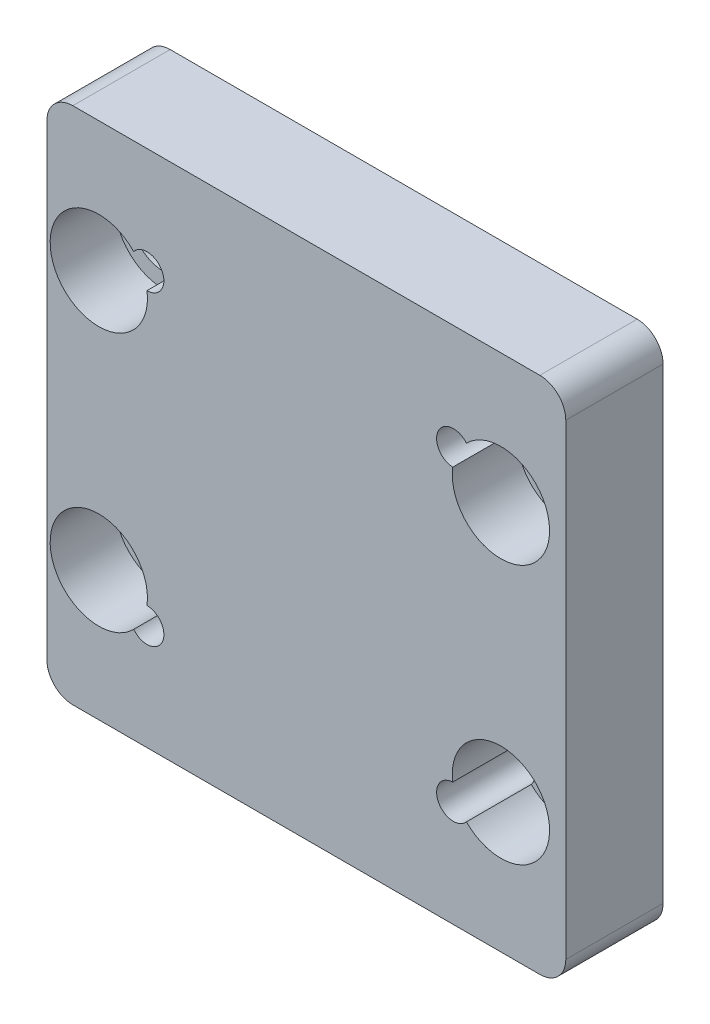
ISO-10303-21;
HEADER;
FILE_DESCRIPTION(('STEP AP214'),'2;1');
FILE_NAME('part.step','',(''),(''),'','','');
FILE_SCHEMA(('AUTOMOTIVE_DESIGN { 1 0 10303 214 1 1 1 1 }'));
ENDSEC;
DATA;
#1=APPLICATION_CONTEXT('core data for automotive mechanical design processes');
#2=APPLICATION_PROTOCOL_DEFINITION('international standard','automotive_design',2000,#1);
#3=PRODUCT_CONTEXT('',#1,'mechanical');
#4=PRODUCT('Part','Part','',(#3));
#5=PRODUCT_RELATED_PRODUCT_CATEGORY('part','',(#4));
#6=PRODUCT_DEFINITION_FORMATION('','',#4);
#7=PRODUCT_DEFINITION_CONTEXT('part definition',#1,'design');
#8=PRODUCT_DEFINITION('design','',#6,#7);
#9=PRODUCT_DEFINITION_SHAPE('','',#8);
#10=(LENGTH_UNIT() NAMED_UNIT(*) SI_UNIT(.MILLI.,.METRE.));
#11=(NAMED_UNIT(*) PLANE_ANGLE_UNIT() SI_UNIT($,.RADIAN.));
#12=(NAMED_UNIT(*) SI_UNIT($,.STERADIAN.) SOLID_ANGLE_UNIT());
#13=UNCERTAINTY_MEASURE_WITH_UNIT(LENGTH_MEASURE(1.E-05),#10,'distance_accuracy_value','');
#14=(GEOMETRIC_REPRESENTATION_CONTEXT(3) GLOBAL_UNCERTAINTY_ASSIGNED_CONTEXT((#13)) GLOBAL_UNIT_ASSIGNED_CONTEXT((#10,
#11,#12)) REPRESENTATION_CONTEXT('',''));
#15=CARTESIAN_POINT('',(0.,0.,0.));
#16=DIRECTION('',(0.,0.,1.));
#17=DIRECTION('',(1.,0.,0.));
#18=AXIS2_PLACEMENT_3D('',#15,#16,#17);
#19=CARTESIAN_POINT('',(0.,0.,9.525));
#20=DIRECTION('',(0.,0.,-1.));
#21=DIRECTION('',(-1.,0.,0.));
#22=AXIS2_PLACEMENT_3D('',#19,#20,#21);
#23=PLANE('',#22);
#24=DIRECTION('',(1.,0.,0.));
#25=VECTOR('',#24,1.);
#26=CARTESIAN_POINT('',(0.,0.,9.525));
#27=LINE('',#26,#25);
#28=CARTESIAN_POINT('',(2.54,0.,9.525));
#29=VERTEX_POINT('',#28);
#30=CARTESIAN_POINT('',(48.26,0.,9.525));
#31=VERTEX_POINT('',#30);
#32=EDGE_CURVE('E217',#29,#31,#27,.T.);
#33=ORIENTED_EDGE('',*,*,#32,.T.);
#34=CARTESIAN_POINT('',(48.26,2.54,9.525));
#35=DIRECTION('',(0.,0.,-1.));
#36=DIRECTION('',(-1.,0.,0.));
#37=AXIS2_PLACEMENT_3D('',#34,#35,#36);
#38=CIRCLE('',#37,2.54);
#39=CARTESIAN_POINT('',(50.8,2.54,9.525));
#40=VERTEX_POINT('',#39);
#41=EDGE_CURVE('E195',#31,#40,#38,.F.);
#42=ORIENTED_EDGE('',*,*,#41,.T.);
#43=DIRECTION('',(0.,1.,0.));
#44=VECTOR('',#43,1.);
#45=CARTESIAN_POINT('',(50.8,0.,9.525));
#46=LINE('',#45,#44);
#47=CARTESIAN_POINT('',(50.8,48.26,9.525));
#48=VERTEX_POINT('',#47);
#49=EDGE_CURVE('E277',#40,#48,#46,.T.);
#50=ORIENTED_EDGE('',*,*,#49,.T.);
#51=CARTESIAN_POINT('',(48.26,48.26,9.525));
#52=DIRECTION('',(0.,0.,-1.));
#53=DIRECTION('',(-1.,0.,0.));
#54=AXIS2_PLACEMENT_3D('',#51,#52,#53);
#55=CIRCLE('',#54,2.54);
#56=CARTESIAN_POINT('',(48.26,50.8,9.525));
#57=VERTEX_POINT('',#56);
#58=EDGE_CURVE('E55',#48,#57,#55,.F.);
#59=ORIENTED_EDGE('',*,*,#58,.T.);
#60=DIRECTION('',(-1.,0.,0.));
#61=VECTOR('',#60,1.);
#62=CARTESIAN_POINT('',(0.,50.8,9.525));
#63=LINE('',#62,#61);
#64=CARTESIAN_POINT('',(2.54,50.8,9.525));
#65=VERTEX_POINT('',#64);
#66=EDGE_CURVE('E206',#57,#65,#63,.T.);
#67=ORIENTED_EDGE('',*,*,#66,.T.);
#68=CARTESIAN_POINT('',(2.54,48.26,9.525));
#69=DIRECTION('',(0.,0.,-1.));
#70=DIRECTION('',(-1.,0.,0.));
#71=AXIS2_PLACEMENT_3D('',#68,#69,#70);
#72=CIRCLE('',#71,2.54);
#73=CARTESIAN_POINT('',(0.,48.26,9.525));
#74=VERTEX_POINT('',#73);
#75=EDGE_CURVE('E191',#65,#74,#72,.F.);
#76=ORIENTED_EDGE('',*,*,#75,.T.);
#77=DIRECTION('',(0.,-1.,0.));
#78=VECTOR('',#77,1.);
#79=CARTESIAN_POINT('',(0.,0.,9.525));
#80=LINE('',#79,#78);
#81=CARTESIAN_POINT('',(0.,2.54,9.525));
#82=VERTEX_POINT('',#81);
#83=EDGE_CURVE('E213',#74,#82,#80,.T.);
#84=ORIENTED_EDGE('',*,*,#83,.T.);
#85=CARTESIAN_POINT('',(2.54,2.54,9.525));
#86=DIRECTION('',(0.,0.,-1.));
#87=DIRECTION('',(-1.,0.,0.));
#88=AXIS2_PLACEMENT_3D('',#85,#86,#87);
#89=CIRCLE('',#88,2.54);
#90=EDGE_CURVE('E193',#82,#29,#89,.F.);
#91=ORIENTED_EDGE('',*,*,#90,.T.);
#92=EDGE_LOOP('',(#33,#42,#50,#59,#67,#76,#84,#91));
#93=FACE_BOUND('',#92,.T.);
#94=CARTESIAN_POINT('',(39.8,10.4,9.525));
#95=DIRECTION('',(0.,0.,1.));
#96=DIRECTION('',(1.,0.,0.));
#97=AXIS2_PLACEMENT_3D('',#94,#95,#96);
#98=CIRCLE('',#97,1.65);
#99=CARTESIAN_POINT('',(39.7322573472271,12.0486087871279,9.525));
#100=VERTEX_POINT('',#99);
#101=CARTESIAN_POINT('',(41.0691996314074,9.34566025606765,9.525));
#102=VERTEX_POINT('',#101);
#103=EDGE_CURVE('E262',#100,#102,#98,.T.);
#104=ORIENTED_EDGE('',*,*,#103,.F.);
#105=CARTESIAN_POINT('',(44.45,12.7,9.525));
#106=DIRECTION('',(0.,0.,1.));
#107=DIRECTION('',(1.,0.,0.));
#108=AXIS2_PLACEMENT_3D('',#105,#106,#107);
#109=CIRCLE('',#108,4.7625);
#110=EDGE_CURVE('E601',#102,#100,#109,.T.);
#111=ORIENTED_EDGE('',*,*,#110,.F.);
#112=EDGE_LOOP('',(#104,#111));
#113=FACE_BOUND('',#112,.T.);
#114=CARTESIAN_POINT('',(9.8,40.4,9.525));
#115=DIRECTION('',(0.,0.,1.));
#116=DIRECTION('',(1.,0.,0.));
#117=AXIS2_PLACEMENT_3D('',#114,#115,#116);
#118=CIRCLE('',#117,1.65);
#119=CARTESIAN_POINT('',(9.79793435404736,38.7500012929984,9.525));
#120=VERTEX_POINT('',#119);
#121=CARTESIAN_POINT('',(8.49924029156137,41.4151473690567,9.525));
#122=VERTEX_POINT('',#121);
#123=EDGE_CURVE('E265',#120,#122,#118,.T.);
#124=ORIENTED_EDGE('',*,*,#123,.F.);
#125=CARTESIAN_POINT('',(5.07999999999999,38.1,9.525));
#126=DIRECTION('',(0.,0.,1.));
#127=DIRECTION('',(1.,0.,0.));
#128=AXIS2_PLACEMENT_3D('',#125,#126,#127);
#129=CIRCLE('',#128,4.7625);
#130=EDGE_CURVE('E622',#122,#120,#129,.T.);
#131=ORIENTED_EDGE('',*,*,#130,.F.);
#132=EDGE_LOOP('',(#124,#131));
#133=FACE_BOUND('',#132,.T.);
#134=CARTESIAN_POINT('',(39.8,40.4,9.525));
#135=DIRECTION('',(0.,0.,1.));
#136=DIRECTION('',(1.,0.,0.));
#137=AXIS2_PLACEMENT_3D('',#134,#135,#136);
#138=CIRCLE('',#137,1.65);
#139=CARTESIAN_POINT('',(41.0691996314074,41.4543397439323,9.525));
#140=VERTEX_POINT('',#139);
#141=CARTESIAN_POINT('',(39.7322573472271,38.7513912128721,9.525));
#142=VERTEX_POINT('',#141);
#143=EDGE_CURVE('E612',#140,#142,#138,.T.);
#144=ORIENTED_EDGE('',*,*,#143,.F.);
#145=CARTESIAN_POINT('',(44.45,38.1,9.525));
#146=DIRECTION('',(0.,0.,1.));
#147=DIRECTION('',(1.,0.,0.));
#148=AXIS2_PLACEMENT_3D('',#145,#146,#147);
#149=CIRCLE('',#148,4.7625);
#150=EDGE_CURVE('E153',#142,#140,#149,.T.);
#151=ORIENTED_EDGE('',*,*,#150,.F.);
#152=EDGE_LOOP('',(#144,#151));
#153=FACE_BOUND('',#152,.T.);
#154=CARTESIAN_POINT('',(5.07999999999999,12.7,9.525));
#155=DIRECTION('',(0.,0.,1.));
#156=DIRECTION('',(1.,0.,0.));
#157=AXIS2_PLACEMENT_3D('',#154,#155,#156);
#158=CIRCLE('',#157,4.7625);
#159=CARTESIAN_POINT('',(9.79793435404736,12.0499987070016,9.525));
#160=VERTEX_POINT('',#159);
#161=CARTESIAN_POINT('',(8.49924029156137,9.38485263094334,9.525));
#162=VERTEX_POINT('',#161);
#163=EDGE_CURVE('E257',#160,#162,#158,.T.);
#164=ORIENTED_EDGE('',*,*,#163,.F.);
#165=CARTESIAN_POINT('',(9.79999999999999,10.4,9.525));
#166=DIRECTION('',(0.,0.,1.));
#167=DIRECTION('',(1.,0.,0.));
#168=AXIS2_PLACEMENT_3D('',#165,#166,#167);
#169=CIRCLE('',#168,1.65);
#170=EDGE_CURVE('E251',#162,#160,#169,.T.);
#171=ORIENTED_EDGE('',*,*,#170,.F.);
#172=EDGE_LOOP('',(#164,#171));
#173=FACE_BOUND('',#172,.T.);
#174=ADVANCED_FACE('F35',(#93,#113,#133,#153,#173),#23,.F.);
#175=CARTESIAN_POINT('',(0.,0.,9.525));
#176=DIRECTION('',(1.,0.,0.));
#177=DIRECTION('',(0.,0.,-1.));
#178=AXIS2_PLACEMENT_3D('',#175,#176,#177);
#179=PLANE('',#178);
#180=DIRECTION('',(0.,-1.,0.));
#181=VECTOR('',#180,1.);
#182=CARTESIAN_POINT('',(0.,0.,0.));
#183=LINE('',#182,#181);
#184=CARTESIAN_POINT('',(0.,48.26,0.));
#185=VERTEX_POINT('',#184);
#186=CARTESIAN_POINT('',(0.,2.54,0.));
#187=VERTEX_POINT('',#186);
#188=EDGE_CURVE('E273',#185,#187,#183,.T.);
#189=ORIENTED_EDGE('',*,*,#188,.T.);
#190=DIRECTION('',(0.,0.,-1.));
#191=VECTOR('',#190,1.);
#192=CARTESIAN_POINT('',(0.,2.54,9.525));
#193=LINE('',#192,#191);
#194=EDGE_CURVE('E200',#187,#82,#193,.F.);
#195=ORIENTED_EDGE('',*,*,#194,.T.);
#196=ORIENTED_EDGE('',*,*,#83,.F.);
#197=DIRECTION('',(0.,0.,-1.));
#198=VECTOR('',#197,1.);
#199=CARTESIAN_POINT('',(0.,48.26,9.525));
#200=LINE('',#199,#198);
#201=EDGE_CURVE('E197',#74,#185,#200,.T.);
#202=ORIENTED_EDGE('',*,*,#201,.T.);
#203=EDGE_LOOP('',(#189,#195,#196,#202));
#204=FACE_BOUND('',#203,.T.);
#205=ADVANCED_FACE('F305',(#204),#179,.F.);
#206=CARTESIAN_POINT('',(0.,0.,9.525));
#207=DIRECTION('',(0.,1.,0.));
#208=DIRECTION('',(0.,0.,1.));
#209=AXIS2_PLACEMENT_3D('',#206,#207,#208);
#210=PLANE('',#209);
#211=DIRECTION('',(1.,0.,0.));
#212=VECTOR('',#211,1.);
#213=CARTESIAN_POINT('',(0.,0.,0.));
#214=LINE('',#213,#212);
#215=CARTESIAN_POINT('',(2.54,0.,0.));
#216=VERTEX_POINT('',#215);
#217=CARTESIAN_POINT('',(48.26,0.,0.));
#218=VERTEX_POINT('',#217);
#219=EDGE_CURVE('E219',#216,#218,#214,.T.);
#220=ORIENTED_EDGE('',*,*,#219,.T.);
#221=DIRECTION('',(0.,0.,-1.));
#222=VECTOR('',#221,1.);
#223=CARTESIAN_POINT('',(48.26,0.,9.525));
#224=LINE('',#223,#222);
#225=EDGE_CURVE('E188',#218,#31,#224,.F.);
#226=ORIENTED_EDGE('',*,*,#225,.T.);
#227=ORIENTED_EDGE('',*,*,#32,.F.);
#228=DIRECTION('',(0.,0.,-1.));
#229=VECTOR('',#228,1.);
#230=CARTESIAN_POINT('',(2.54,0.,9.525));
#231=LINE('',#230,#229);
#232=EDGE_CURVE('E185',#29,#216,#231,.T.);
#233=ORIENTED_EDGE('',*,*,#232,.T.);
#234=EDGE_LOOP('',(#220,#226,#227,#233));
#235=FACE_BOUND('',#234,.T.);
#236=ADVANCED_FACE('F285',(#235),#210,.F.);
#237=CARTESIAN_POINT('',(50.8,0.,9.525));
#238=DIRECTION('',(-1.,0.,0.));
#239=DIRECTION('',(0.,0.,1.));
#240=AXIS2_PLACEMENT_3D('',#237,#238,#239);
#241=PLANE('',#240);
#242=ORIENTED_EDGE('',*,*,#49,.F.);
#243=DIRECTION('',(0.,0.,-1.));
#244=VECTOR('',#243,1.);
#245=CARTESIAN_POINT('',(50.8,2.54,9.525));
#246=LINE('',#245,#244);
#247=CARTESIAN_POINT('',(50.8,2.54,0.));
#248=VERTEX_POINT('',#247);
#249=EDGE_CURVE('E174',#40,#248,#246,.T.);
#250=ORIENTED_EDGE('',*,*,#249,.T.);
#251=DIRECTION('',(0.,1.,0.));
#252=VECTOR('',#251,1.);
#253=CARTESIAN_POINT('',(50.8,0.,0.));
#254=LINE('',#253,#252);
#255=CARTESIAN_POINT('',(50.8,48.26,0.));
#256=VERTEX_POINT('',#255);
#257=EDGE_CURVE('E214',#248,#256,#254,.T.);
#258=ORIENTED_EDGE('',*,*,#257,.T.);
#259=DIRECTION('',(0.,0.,-1.));
#260=VECTOR('',#259,1.);
#261=CARTESIAN_POINT('',(50.8,48.26,9.525));
#262=LINE('',#261,#260);
#263=EDGE_CURVE('E158',#256,#48,#262,.F.);
#264=ORIENTED_EDGE('',*,*,#263,.T.);
#265=EDGE_LOOP('',(#242,#250,#258,#264));
#266=FACE_BOUND('',#265,.T.);
#267=ADVANCED_FACE('F295',(#266),#241,.F.);
#268=CARTESIAN_POINT('',(0.,50.8,9.525));
#269=DIRECTION('',(0.,-1.,0.));
#270=DIRECTION('',(0.,0.,-1.));
#271=AXIS2_PLACEMENT_3D('',#268,#269,#270);
#272=PLANE('',#271);
#273=DIRECTION('',(-1.,0.,0.));
#274=VECTOR('',#273,1.);
#275=CARTESIAN_POINT('',(0.,50.8,0.));
#276=LINE('',#275,#274);
#277=CARTESIAN_POINT('',(48.26,50.8,0.));
#278=VERTEX_POINT('',#277);
#279=CARTESIAN_POINT('',(2.54,50.8,0.));
#280=VERTEX_POINT('',#279);
#281=EDGE_CURVE('E205',#278,#280,#276,.T.);
#282=ORIENTED_EDGE('',*,*,#281,.T.);
#283=DIRECTION('',(0.,0.,-1.));
#284=VECTOR('',#283,1.);
#285=CARTESIAN_POINT('',(2.54,50.8,9.525));
#286=LINE('',#285,#284);
#287=EDGE_CURVE('E11',#280,#65,#286,.F.);
#288=ORIENTED_EDGE('',*,*,#287,.T.);
#289=ORIENTED_EDGE('',*,*,#66,.F.);
#290=DIRECTION('',(0.,0.,-1.));
#291=VECTOR('',#290,1.);
#292=CARTESIAN_POINT('',(48.26,50.8,9.525));
#293=LINE('',#292,#291);
#294=EDGE_CURVE('E43',#57,#278,#293,.T.);
#295=ORIENTED_EDGE('',*,*,#294,.T.);
#296=EDGE_LOOP('',(#282,#288,#289,#295));
#297=FACE_BOUND('',#296,.T.);
#298=ADVANCED_FACE('F204',(#297),#272,.F.);
#299=CARTESIAN_POINT('',(0.,0.,0.));
#300=DIRECTION('',(0.,0.,-1.));
#301=DIRECTION('',(-1.,0.,0.));
#302=AXIS2_PLACEMENT_3D('',#299,#300,#301);
#303=PLANE('',#302);
#304=CARTESIAN_POINT('',(44.45,38.1,0.));
#305=DIRECTION('',(0.,0.,1.));
#306=DIRECTION('',(1.,0.,0.));
#307=AXIS2_PLACEMENT_3D('',#304,#305,#306);
#308=CIRCLE('',#307,3.2639);
#309=CARTESIAN_POINT('',(47.7139,38.1,0.));
#310=VERTEX_POINT('',#309);
#311=EDGE_CURVE('E658',#310,#310,#308,.T.);
#312=ORIENTED_EDGE('',*,*,#311,.T.);
#313=EDGE_LOOP('',(#312));
#314=FACE_BOUND('',#313,.T.);
#315=CARTESIAN_POINT('',(5.07999999999999,12.7,0.));
#316=DIRECTION('',(0.,0.,1.));
#317=DIRECTION('',(1.,0.,0.));
#318=AXIS2_PLACEMENT_3D('',#315,#316,#317);
#319=CIRCLE('',#318,3.2639);
#320=CARTESIAN_POINT('',(8.34389999999999,12.7,0.));
#321=VERTEX_POINT('',#320);
#322=EDGE_CURVE('E624',#321,#321,#319,.T.);
#323=ORIENTED_EDGE('',*,*,#322,.T.);
#324=EDGE_LOOP('',(#323));
#325=FACE_BOUND('',#324,.T.);
#326=CARTESIAN_POINT('',(5.07999999999999,38.1,0.));
#327=DIRECTION('',(0.,0.,1.));
#328=DIRECTION('',(1.,0.,0.));
#329=AXIS2_PLACEMENT_3D('',#326,#327,#328);
#330=CIRCLE('',#329,3.2639);
#331=CARTESIAN_POINT('',(8.34389999999999,38.1,0.));
#332=VERTEX_POINT('',#331);
#333=EDGE_CURVE('E606',#332,#332,#330,.T.);
#334=ORIENTED_EDGE('',*,*,#333,.T.);
#335=EDGE_LOOP('',(#334));
#336=FACE_BOUND('',#335,.T.);
#337=CARTESIAN_POINT('',(44.45,12.7,0.));
#338=DIRECTION('',(0.,0.,1.));
#339=DIRECTION('',(1.,0.,0.));
#340=AXIS2_PLACEMENT_3D('',#337,#338,#339);
#341=CIRCLE('',#340,3.2639);
#342=CARTESIAN_POINT('',(47.7139,12.7,0.));
#343=VERTEX_POINT('',#342);
#344=EDGE_CURVE('E604',#343,#343,#341,.T.);
#345=ORIENTED_EDGE('',*,*,#344,.T.);
#346=EDGE_LOOP('',(#345));
#347=FACE_BOUND('',#346,.T.);
#348=CARTESIAN_POINT('',(39.8,40.4,0.));
#349=DIRECTION('',(0.,0.,1.));
#350=DIRECTION('',(1.,0.,0.));
#351=AXIS2_PLACEMENT_3D('',#348,#349,#350);
#352=CIRCLE('',#351,1.65);
#353=CARTESIAN_POINT('',(41.45,40.4,0.));
#354=VERTEX_POINT('',#353);
#355=EDGE_CURVE('E614',#354,#354,#352,.T.);
#356=ORIENTED_EDGE('',*,*,#355,.T.);
#357=EDGE_LOOP('',(#356));
#358=FACE_BOUND('',#357,.T.);
#359=CARTESIAN_POINT('',(9.8,40.4,0.));
#360=DIRECTION('',(0.,0.,1.));
#361=DIRECTION('',(1.,0.,0.));
#362=AXIS2_PLACEMENT_3D('',#359,#360,#361);
#363=CIRCLE('',#362,1.65);
#364=CARTESIAN_POINT('',(11.45,40.4,0.));
#365=VERTEX_POINT('',#364);
#366=EDGE_CURVE('E259',#365,#365,#363,.T.);
#367=ORIENTED_EDGE('',*,*,#366,.T.);
#368=EDGE_LOOP('',(#367));
#369=FACE_BOUND('',#368,.T.);
#370=CARTESIAN_POINT('',(9.79999999999999,10.4,0.));
#371=DIRECTION('',(0.,0.,1.));
#372=DIRECTION('',(1.,0.,0.));
#373=AXIS2_PLACEMENT_3D('',#370,#371,#372);
#374=CIRCLE('',#373,1.65);
#375=CARTESIAN_POINT('',(11.45,10.4,0.));
#376=VERTEX_POINT('',#375);
#377=EDGE_CURVE('E258',#376,#376,#374,.T.);
#378=ORIENTED_EDGE('',*,*,#377,.T.);
#379=EDGE_LOOP('',(#378));
#380=FACE_BOUND('',#379,.T.);
#381=CARTESIAN_POINT('',(39.8,10.4,0.));
#382=DIRECTION('',(0.,0.,1.));
#383=DIRECTION('',(1.,0.,0.));
#384=AXIS2_PLACEMENT_3D('',#381,#382,#383);
#385=CIRCLE('',#384,1.65);
#386=CARTESIAN_POINT('',(41.45,10.4,0.));
#387=VERTEX_POINT('',#386);
#388=EDGE_CURVE('E271',#387,#387,#385,.T.);
#389=ORIENTED_EDGE('',*,*,#388,.T.);
#390=EDGE_LOOP('',(#389));
#391=FACE_BOUND('',#390,.T.);
#392=ORIENTED_EDGE('',*,*,#257,.F.);
#393=CARTESIAN_POINT('',(48.26,2.54,0.));
#394=DIRECTION('',(0.,0.,-1.));
#395=DIRECTION('',(-1.,0.,0.));
#396=AXIS2_PLACEMENT_3D('',#393,#394,#395);
#397=CIRCLE('',#396,2.54);
#398=EDGE_CURVE('E183',#248,#218,#397,.T.);
#399=ORIENTED_EDGE('',*,*,#398,.T.);
#400=ORIENTED_EDGE('',*,*,#219,.F.);
#401=CARTESIAN_POINT('',(2.54,2.54,0.));
#402=DIRECTION('',(0.,0.,-1.));
#403=DIRECTION('',(-1.,0.,0.));
#404=AXIS2_PLACEMENT_3D('',#401,#402,#403);
#405=CIRCLE('',#404,2.54);
#406=EDGE_CURVE('E181',#216,#187,#405,.T.);
#407=ORIENTED_EDGE('',*,*,#406,.T.);
#408=ORIENTED_EDGE('',*,*,#188,.F.);
#409=CARTESIAN_POINT('',(2.54,48.26,0.));
#410=DIRECTION('',(0.,0.,-1.));
#411=DIRECTION('',(-1.,0.,0.));
#412=AXIS2_PLACEMENT_3D('',#409,#410,#411);
#413=CIRCLE('',#412,2.54);
#414=EDGE_CURVE('E179',#185,#280,#413,.T.);
#415=ORIENTED_EDGE('',*,*,#414,.T.);
#416=ORIENTED_EDGE('',*,*,#281,.F.);
#417=CARTESIAN_POINT('',(48.26,48.26,0.));
#418=DIRECTION('',(0.,0.,-1.));
#419=DIRECTION('',(-1.,0.,0.));
#420=AXIS2_PLACEMENT_3D('',#417,#418,#419);
#421=CIRCLE('',#420,2.54);
#422=EDGE_CURVE('E177',#278,#256,#421,.T.);
#423=ORIENTED_EDGE('',*,*,#422,.T.);
#424=EDGE_LOOP('',(#392,#399,#400,#407,#408,#415,#416,#423));
#425=FACE_BOUND('',#424,.T.);
#426=ADVANCED_FACE('F210',(#314,#325,#336,#347,#358,#369,#380,#391,#425),#303,.T.);
#427=CARTESIAN_POINT('',(39.8,10.4,9.525));
#428=DIRECTION('',(0.,0.,1.));
#429=DIRECTION('',(1.,0.,0.));
#430=AXIS2_PLACEMENT_3D('',#427,#428,#429);
#431=CYLINDRICAL_SURFACE('',#430,1.65);
#432=ORIENTED_EDGE('',*,*,#388,.F.);
#433=EDGE_LOOP('',(#432));
#434=FACE_BOUND('',#433,.T.);
#435=CARTESIAN_POINT('',(39.8,10.4,3.175));
#436=DIRECTION('',(0.,0.,-1.));
#437=DIRECTION('',(-1.,0.,0.));
#438=AXIS2_PLACEMENT_3D('',#435,#436,#437);
#439=CIRCLE('',#438,1.65);
#440=CARTESIAN_POINT('',(41.0691996314074,9.34566025606766,3.175));
#441=VERTEX_POINT('',#440);
#442=CARTESIAN_POINT('',(39.7322573472271,12.0486087871279,3.175));
#443=VERTEX_POINT('',#442);
#444=EDGE_CURVE('E226',#441,#443,#439,.F.);
#445=ORIENTED_EDGE('',*,*,#444,.T.);
#446=DIRECTION('',(0.,0.,1.));
#447=VECTOR('',#446,1.);
#448=CARTESIAN_POINT('',(39.7322573472271,12.0486087871279,6.35));
#449=LINE('',#448,#447);
#450=EDGE_CURVE('E229',#443,#100,#449,.T.);
#451=ORIENTED_EDGE('',*,*,#450,.T.);
#452=ORIENTED_EDGE('',*,*,#103,.T.);
#453=DIRECTION('',(0.,0.,1.));
#454=VECTOR('',#453,1.);
#455=CARTESIAN_POINT('',(41.0691996314074,9.34566025606765,6.35));
#456=LINE('',#455,#454);
#457=EDGE_CURVE('E223',#102,#441,#456,.F.);
#458=ORIENTED_EDGE('',*,*,#457,.T.);
#459=EDGE_LOOP('',(#445,#451,#452,#458));
#460=FACE_BOUND('',#459,.T.);
#461=ADVANCED_FACE('F314',(#434,#460),#431,.F.);
#462=CARTESIAN_POINT('',(9.79999999999999,10.4,9.525));
#463=DIRECTION('',(0.,0.,1.));
#464=DIRECTION('',(1.,0.,0.));
#465=AXIS2_PLACEMENT_3D('',#462,#463,#464);
#466=CYLINDRICAL_SURFACE('',#465,1.65);
#467=ORIENTED_EDGE('',*,*,#377,.F.);
#468=EDGE_LOOP('',(#467));
#469=FACE_BOUND('',#468,.T.);
#470=CARTESIAN_POINT('',(9.79999999999999,10.4,3.175));
#471=DIRECTION('',(0.,0.,-1.));
#472=DIRECTION('',(-1.,0.,0.));
#473=AXIS2_PLACEMENT_3D('',#470,#471,#472);
#474=CIRCLE('',#473,1.65);
#475=CARTESIAN_POINT('',(9.79793435404736,12.0499987070016,3.175));
#476=VERTEX_POINT('',#475);
#477=CARTESIAN_POINT('',(8.49924029156137,9.38485263094334,3.175));
#478=VERTEX_POINT('',#477);
#479=EDGE_CURVE('E244',#476,#478,#474,.F.);
#480=ORIENTED_EDGE('',*,*,#479,.T.);
#481=DIRECTION('',(0.,0.,1.));
#482=VECTOR('',#481,1.);
#483=CARTESIAN_POINT('',(8.49924029156137,9.38485263094334,6.35));
#484=LINE('',#483,#482);
#485=EDGE_CURVE('E169',#478,#162,#484,.T.);
#486=ORIENTED_EDGE('',*,*,#485,.T.);
#487=ORIENTED_EDGE('',*,*,#170,.T.);
#488=DIRECTION('',(0.,0.,1.));
#489=VECTOR('',#488,1.);
#490=CARTESIAN_POINT('',(9.79793435404736,12.0499987070016,6.35));
#491=LINE('',#490,#489);
#492=EDGE_CURVE('E241',#160,#476,#491,.F.);
#493=ORIENTED_EDGE('',*,*,#492,.T.);
#494=EDGE_LOOP('',(#480,#486,#487,#493));
#495=FACE_BOUND('',#494,.T.);
#496=ADVANCED_FACE('F250',(#469,#495),#466,.F.);
#497=CARTESIAN_POINT('',(9.8,40.4,9.525));
#498=DIRECTION('',(0.,0.,1.));
#499=DIRECTION('',(1.,0.,0.));
#500=AXIS2_PLACEMENT_3D('',#497,#498,#499);
#501=CYLINDRICAL_SURFACE('',#500,1.65);
#502=ORIENTED_EDGE('',*,*,#366,.F.);
#503=EDGE_LOOP('',(#502));
#504=FACE_BOUND('',#503,.T.);
#505=CARTESIAN_POINT('',(9.8,40.4,3.175));
#506=DIRECTION('',(0.,0.,-1.));
#507=DIRECTION('',(-1.,0.,0.));
#508=AXIS2_PLACEMENT_3D('',#505,#506,#507);
#509=CIRCLE('',#508,1.65);
#510=CARTESIAN_POINT('',(8.49924029156137,41.4151473690567,3.175));
#511=VERTEX_POINT('',#510);
#512=CARTESIAN_POINT('',(9.79793435404736,38.7500012929984,3.175));
#513=VERTEX_POINT('',#512);
#514=EDGE_CURVE('E235',#511,#513,#509,.F.);
#515=ORIENTED_EDGE('',*,*,#514,.T.);
#516=DIRECTION('',(0.,0.,1.));
#517=VECTOR('',#516,1.);
#518=CARTESIAN_POINT('',(9.79793435404736,38.7500012929984,6.35));
#519=LINE('',#518,#517);
#520=EDGE_CURVE('E238',#513,#120,#519,.T.);
#521=ORIENTED_EDGE('',*,*,#520,.T.);
#522=ORIENTED_EDGE('',*,*,#123,.T.);
#523=DIRECTION('',(0.,0.,1.));
#524=VECTOR('',#523,1.);
#525=CARTESIAN_POINT('',(8.49924029156137,41.4151473690567,6.35));
#526=LINE('',#525,#524);
#527=EDGE_CURVE('E232',#122,#511,#526,.F.);
#528=ORIENTED_EDGE('',*,*,#527,.T.);
#529=EDGE_LOOP('',(#515,#521,#522,#528));
#530=FACE_BOUND('',#529,.T.);
#531=ADVANCED_FACE('F509',(#504,#530),#501,.F.);
#532=CARTESIAN_POINT('',(39.8,40.4,9.525));
#533=DIRECTION('',(0.,0.,1.));
#534=DIRECTION('',(1.,0.,0.));
#535=AXIS2_PLACEMENT_3D('',#532,#533,#534);
#536=CYLINDRICAL_SURFACE('',#535,1.65);
#537=ORIENTED_EDGE('',*,*,#355,.F.);
#538=EDGE_LOOP('',(#537));
#539=FACE_BOUND('',#538,.T.);
#540=CARTESIAN_POINT('',(39.8,40.4,3.175));
#541=DIRECTION('',(0.,0.,-1.));
#542=DIRECTION('',(-1.,0.,0.));
#543=AXIS2_PLACEMENT_3D('',#540,#541,#542);
#544=CIRCLE('',#543,1.65);
#545=CARTESIAN_POINT('',(39.7322573472271,38.7513912128721,3.175));
#546=VERTEX_POINT('',#545);
#547=CARTESIAN_POINT('',(41.0691996314074,41.4543397439323,3.175));
#548=VERTEX_POINT('',#547);
#549=EDGE_CURVE('E159',#546,#548,#544,.F.);
#550=ORIENTED_EDGE('',*,*,#549,.T.);
#551=DIRECTION('',(0.,0.,1.));
#552=VECTOR('',#551,1.);
#553=CARTESIAN_POINT('',(41.0691996314074,41.4543397439323,6.35));
#554=LINE('',#553,#552);
#555=EDGE_CURVE('E147',#548,#140,#554,.T.);
#556=ORIENTED_EDGE('',*,*,#555,.T.);
#557=ORIENTED_EDGE('',*,*,#143,.T.);
#558=DIRECTION('',(0.,0.,1.));
#559=VECTOR('',#558,1.);
#560=CARTESIAN_POINT('',(39.7322573472271,38.7513912128721,6.35));
#561=LINE('',#560,#559);
#562=EDGE_CURVE('E167',#142,#546,#561,.F.);
#563=ORIENTED_EDGE('',*,*,#562,.T.);
#564=EDGE_LOOP('',(#550,#556,#557,#563));
#565=FACE_BOUND('',#564,.T.);
#566=ADVANCED_FACE('F166',(#539,#565),#536,.F.);
#567=CARTESIAN_POINT('',(47.7139,12.7,3.175));
#568=DIRECTION('',(0.,0.,-1.));
#569=DIRECTION('',(-1.,0.,0.));
#570=AXIS2_PLACEMENT_3D('',#567,#568,#569);
#571=PLANE('',#570);
#572=CARTESIAN_POINT('',(44.45,12.7,3.175));
#573=DIRECTION('',(0.,0.,1.));
#574=DIRECTION('',(1.,0.,0.));
#575=AXIS2_PLACEMENT_3D('',#572,#573,#574);
#576=CIRCLE('',#575,3.2639);
#577=CARTESIAN_POINT('',(47.7139,12.7,3.175));
#578=VERTEX_POINT('',#577);
#579=EDGE_CURVE('E600',#578,#578,#576,.T.);
#580=ORIENTED_EDGE('',*,*,#579,.F.);
#581=EDGE_LOOP('',(#580));
#582=FACE_BOUND('',#581,.T.);
#583=CARTESIAN_POINT('',(44.45,12.7,3.175));
#584=DIRECTION('',(0.,0.,1.));
#585=DIRECTION('',(1.,0.,0.));
#586=AXIS2_PLACEMENT_3D('',#583,#584,#585);
#587=CIRCLE('',#586,4.7625);
#588=EDGE_CURVE('E599',#441,#443,#587,.T.);
#589=ORIENTED_EDGE('',*,*,#588,.T.);
#590=ORIENTED_EDGE('',*,*,#444,.F.);
#591=EDGE_LOOP('',(#589,#590));
#592=FACE_BOUND('',#591,.T.);
#593=ADVANCED_FACE('F467',(#582,#592),#571,.F.);
#594=CARTESIAN_POINT('',(44.45,12.7,9.525));
#595=DIRECTION('',(0.,0.,1.));
#596=DIRECTION('',(1.,0.,0.));
#597=AXIS2_PLACEMENT_3D('',#594,#595,#596);
#598=CYLINDRICAL_SURFACE('',#597,4.7625);
#599=ORIENTED_EDGE('',*,*,#588,.F.);
#600=ORIENTED_EDGE('',*,*,#457,.F.);
#601=ORIENTED_EDGE('',*,*,#110,.T.);
#602=ORIENTED_EDGE('',*,*,#450,.F.);
#603=EDGE_LOOP('',(#599,#600,#601,#602));
#604=FACE_BOUND('',#603,.T.);
#605=ADVANCED_FACE('F459',(#604),#598,.F.);
#606=CARTESIAN_POINT('',(44.45,12.7,9.525));
#607=DIRECTION('',(0.,0.,1.));
#608=DIRECTION('',(1.,0.,0.));
#609=AXIS2_PLACEMENT_3D('',#606,#607,#608);
#610=CYLINDRICAL_SURFACE('',#609,3.2639);
#611=ORIENTED_EDGE('',*,*,#344,.F.);
#612=EDGE_LOOP('',(#611));
#613=FACE_BOUND('',#612,.T.);
#614=ORIENTED_EDGE('',*,*,#579,.T.);
#615=EDGE_LOOP('',(#614));
#616=FACE_BOUND('',#615,.T.);
#617=ADVANCED_FACE('F449',(#613,#616),#610,.F.);
#618=CARTESIAN_POINT('',(8.34389999999999,38.1,3.175));
#619=DIRECTION('',(0.,0.,-1.));
#620=DIRECTION('',(-1.,0.,0.));
#621=AXIS2_PLACEMENT_3D('',#618,#619,#620);
#622=PLANE('',#621);
#623=CARTESIAN_POINT('',(5.07999999999999,38.1,3.175));
#624=DIRECTION('',(0.,0.,1.));
#625=DIRECTION('',(1.,0.,0.));
#626=AXIS2_PLACEMENT_3D('',#623,#624,#625);
#627=CIRCLE('',#626,3.2639);
#628=CARTESIAN_POINT('',(8.34389999999999,38.1,3.175));
#629=VERTEX_POINT('',#628);
#630=EDGE_CURVE('E627',#629,#629,#627,.T.);
#631=ORIENTED_EDGE('',*,*,#630,.F.);
#632=EDGE_LOOP('',(#631));
#633=FACE_BOUND('',#632,.T.);
#634=CARTESIAN_POINT('',(5.07999999999999,38.1,3.175));
#635=DIRECTION('',(0.,0.,1.));
#636=DIRECTION('',(1.,0.,0.));
#637=AXIS2_PLACEMENT_3D('',#634,#635,#636);
#638=CIRCLE('',#637,4.7625);
#639=EDGE_CURVE('E623',#511,#513,#638,.T.);
#640=ORIENTED_EDGE('',*,*,#639,.T.);
#641=ORIENTED_EDGE('',*,*,#514,.F.);
#642=EDGE_LOOP('',(#640,#641));
#643=FACE_BOUND('',#642,.T.);
#644=ADVANCED_FACE('F444',(#633,#643),#622,.F.);
#645=CARTESIAN_POINT('',(5.07999999999999,38.1,9.525));
#646=DIRECTION('',(0.,0.,1.));
#647=DIRECTION('',(1.,0.,0.));
#648=AXIS2_PLACEMENT_3D('',#645,#646,#647);
#649=CYLINDRICAL_SURFACE('',#648,4.7625);
#650=ORIENTED_EDGE('',*,*,#639,.F.);
#651=ORIENTED_EDGE('',*,*,#527,.F.);
#652=ORIENTED_EDGE('',*,*,#130,.T.);
#653=ORIENTED_EDGE('',*,*,#520,.F.);
#654=EDGE_LOOP('',(#650,#651,#652,#653));
#655=FACE_BOUND('',#654,.T.);
#656=ADVANCED_FACE('F436',(#655),#649,.F.);
#657=CARTESIAN_POINT('',(5.07999999999999,38.1,9.525));
#658=DIRECTION('',(0.,0.,1.));
#659=DIRECTION('',(1.,0.,0.));
#660=AXIS2_PLACEMENT_3D('',#657,#658,#659);
#661=CYLINDRICAL_SURFACE('',#660,3.2639);
#662=ORIENTED_EDGE('',*,*,#333,.F.);
#663=EDGE_LOOP('',(#662));
#664=FACE_BOUND('',#663,.T.);
#665=ORIENTED_EDGE('',*,*,#630,.T.);
#666=EDGE_LOOP('',(#665));
#667=FACE_BOUND('',#666,.T.);
#668=ADVANCED_FACE('F426',(#664,#667),#661,.F.);
#669=CARTESIAN_POINT('',(8.34389999999999,12.7,3.175));
#670=DIRECTION('',(0.,0.,-1.));
#671=DIRECTION('',(-1.,0.,0.));
#672=AXIS2_PLACEMENT_3D('',#669,#670,#671);
#673=PLANE('',#672);
#674=CARTESIAN_POINT('',(5.07999999999999,12.7,3.175));
#675=DIRECTION('',(0.,0.,1.));
#676=DIRECTION('',(1.,0.,0.));
#677=AXIS2_PLACEMENT_3D('',#674,#675,#676);
#678=CIRCLE('',#677,3.2639);
#679=CARTESIAN_POINT('',(8.34389999999999,12.7,3.175));
#680=VERTEX_POINT('',#679);
#681=EDGE_CURVE('E630',#680,#680,#678,.T.);
#682=ORIENTED_EDGE('',*,*,#681,.F.);
#683=EDGE_LOOP('',(#682));
#684=FACE_BOUND('',#683,.T.);
#685=CARTESIAN_POINT('',(5.07999999999999,12.7,3.175));
#686=DIRECTION('',(0.,0.,1.));
#687=DIRECTION('',(1.,0.,0.));
#688=AXIS2_PLACEMENT_3D('',#685,#686,#687);
#689=CIRCLE('',#688,4.7625);
#690=EDGE_CURVE('E655',#476,#478,#689,.T.);
#691=ORIENTED_EDGE('',*,*,#690,.T.);
#692=ORIENTED_EDGE('',*,*,#479,.F.);
#693=EDGE_LOOP('',(#691,#692));
#694=FACE_BOUND('',#693,.T.);
#695=ADVANCED_FACE('F421',(#684,#694),#673,.F.);
#696=CARTESIAN_POINT('',(5.07999999999999,12.7,9.525));
#697=DIRECTION('',(0.,0.,1.));
#698=DIRECTION('',(1.,0.,0.));
#699=AXIS2_PLACEMENT_3D('',#696,#697,#698);
#700=CYLINDRICAL_SURFACE('',#699,4.7625);
#701=ORIENTED_EDGE('',*,*,#690,.F.);
#702=ORIENTED_EDGE('',*,*,#492,.F.);
#703=ORIENTED_EDGE('',*,*,#163,.T.);
#704=ORIENTED_EDGE('',*,*,#485,.F.);
#705=EDGE_LOOP('',(#701,#702,#703,#704));
#706=FACE_BOUND('',#705,.T.);
#707=ADVANCED_FACE('F413',(#706),#700,.F.);
#708=CARTESIAN_POINT('',(5.07999999999999,12.7,9.525));
#709=DIRECTION('',(0.,0.,1.));
#710=DIRECTION('',(1.,0.,0.));
#711=AXIS2_PLACEMENT_3D('',#708,#709,#710);
#712=CYLINDRICAL_SURFACE('',#711,3.2639);
#713=ORIENTED_EDGE('',*,*,#322,.F.);
#714=EDGE_LOOP('',(#713));
#715=FACE_BOUND('',#714,.T.);
#716=ORIENTED_EDGE('',*,*,#681,.T.);
#717=EDGE_LOOP('',(#716));
#718=FACE_BOUND('',#717,.T.);
#719=ADVANCED_FACE('F403',(#715,#718),#712,.F.);
#720=CARTESIAN_POINT('',(47.7139,38.1,3.175));
#721=DIRECTION('',(0.,0.,-1.));
#722=DIRECTION('',(-1.,0.,0.));
#723=AXIS2_PLACEMENT_3D('',#720,#721,#722);
#724=PLANE('',#723);
#725=CARTESIAN_POINT('',(44.45,38.1,3.175));
#726=DIRECTION('',(0.,0.,1.));
#727=DIRECTION('',(1.,0.,0.));
#728=AXIS2_PLACEMENT_3D('',#725,#726,#727);
#729=CIRCLE('',#728,3.2639);
#730=CARTESIAN_POINT('',(47.7139,38.1,3.175));
#731=VERTEX_POINT('',#730);
#732=EDGE_CURVE('E164',#731,#731,#729,.T.);
#733=ORIENTED_EDGE('',*,*,#732,.F.);
#734=EDGE_LOOP('',(#733));
#735=FACE_BOUND('',#734,.T.);
#736=CARTESIAN_POINT('',(44.45,38.1,3.175));
#737=DIRECTION('',(0.,0.,1.));
#738=DIRECTION('',(1.,0.,0.));
#739=AXIS2_PLACEMENT_3D('',#736,#737,#738);
#740=CIRCLE('',#739,4.7625);
#741=EDGE_CURVE('E150',#546,#548,#740,.T.);
#742=ORIENTED_EDGE('',*,*,#741,.T.);
#743=ORIENTED_EDGE('',*,*,#549,.F.);
#744=EDGE_LOOP('',(#742,#743));
#745=FACE_BOUND('',#744,.T.);
#746=ADVANCED_FACE('F162',(#735,#745),#724,.F.);
#747=CARTESIAN_POINT('',(44.45,38.1,9.525));
#748=DIRECTION('',(0.,0.,1.));
#749=DIRECTION('',(1.,0.,0.));
#750=AXIS2_PLACEMENT_3D('',#747,#748,#749);
#751=CYLINDRICAL_SURFACE('',#750,4.7625);
#752=ORIENTED_EDGE('',*,*,#741,.F.);
#753=ORIENTED_EDGE('',*,*,#562,.F.);
#754=ORIENTED_EDGE('',*,*,#150,.T.);
#755=ORIENTED_EDGE('',*,*,#555,.F.);
#756=EDGE_LOOP('',(#752,#753,#754,#755));
#757=FACE_BOUND('',#756,.T.);
#758=ADVANCED_FACE('F149',(#757),#751,.F.);
#759=CARTESIAN_POINT('',(44.45,38.1,9.525));
#760=DIRECTION('',(0.,0.,1.));
#761=DIRECTION('',(1.,0.,0.));
#762=AXIS2_PLACEMENT_3D('',#759,#760,#761);
#763=CYLINDRICAL_SURFACE('',#762,3.2639);
#764=ORIENTED_EDGE('',*,*,#311,.F.);
#765=EDGE_LOOP('',(#764));
#766=FACE_BOUND('',#765,.T.);
#767=ORIENTED_EDGE('',*,*,#732,.T.);
#768=EDGE_LOOP('',(#767));
#769=FACE_BOUND('',#768,.T.);
#770=ADVANCED_FACE('F327',(#766,#769),#763,.F.);
#771=CARTESIAN_POINT('',(48.26,2.54,9.525));
#772=DIRECTION('',(0.,0.,-1.));
#773=DIRECTION('',(-1.,0.,0.));
#774=AXIS2_PLACEMENT_3D('',#771,#772,#773);
#775=CYLINDRICAL_SURFACE('',#774,2.54);
#776=ORIENTED_EDGE('',*,*,#41,.F.);
#777=ORIENTED_EDGE('',*,*,#225,.F.);
#778=ORIENTED_EDGE('',*,*,#398,.F.);
#779=ORIENTED_EDGE('',*,*,#249,.F.);
#780=EDGE_LOOP('',(#776,#777,#778,#779));
#781=FACE_BOUND('',#780,.T.);
#782=ADVANCED_FACE('F290',(#781),#775,.T.);
#783=CARTESIAN_POINT('',(2.54,2.54,9.525));
#784=DIRECTION('',(0.,0.,-1.));
#785=DIRECTION('',(-1.,0.,0.));
#786=AXIS2_PLACEMENT_3D('',#783,#784,#785);
#787=CYLINDRICAL_SURFACE('',#786,2.54);
#788=ORIENTED_EDGE('',*,*,#90,.F.);
#789=ORIENTED_EDGE('',*,*,#194,.F.);
#790=ORIENTED_EDGE('',*,*,#406,.F.);
#791=ORIENTED_EDGE('',*,*,#232,.F.);
#792=EDGE_LOOP('',(#788,#789,#790,#791));
#793=FACE_BOUND('',#792,.T.);
#794=ADVANCED_FACE('F302',(#793),#787,.T.);
#795=CARTESIAN_POINT('',(2.54,48.26,9.525));
#796=DIRECTION('',(0.,0.,-1.));
#797=DIRECTION('',(-1.,0.,0.));
#798=AXIS2_PLACEMENT_3D('',#795,#796,#797);
#799=CYLINDRICAL_SURFACE('',#798,2.54);
#800=ORIENTED_EDGE('',*,*,#75,.F.);
#801=ORIENTED_EDGE('',*,*,#287,.F.);
#802=ORIENTED_EDGE('',*,*,#414,.F.);
#803=ORIENTED_EDGE('',*,*,#201,.F.);
#804=EDGE_LOOP('',(#800,#801,#802,#803));
#805=FACE_BOUND('',#804,.T.);
#806=ADVANCED_FACE('F298',(#805),#799,.T.);
#807=CARTESIAN_POINT('',(48.26,48.26,9.525));
#808=DIRECTION('',(0.,0.,-1.));
#809=DIRECTION('',(-1.,0.,0.));
#810=AXIS2_PLACEMENT_3D('',#807,#808,#809);
#811=CYLINDRICAL_SURFACE('',#810,2.54);
#812=ORIENTED_EDGE('',*,*,#58,.F.);
#813=ORIENTED_EDGE('',*,*,#263,.F.);
#814=ORIENTED_EDGE('',*,*,#422,.F.);
#815=ORIENTED_EDGE('',*,*,#294,.F.);
#816=EDGE_LOOP('',(#812,#813,#814,#815));
#817=FACE_BOUND('',#816,.T.);
#818=ADVANCED_FACE('F37',(#817),#811,.T.);
#819=CLOSED_SHELL('',(#174,#205,#236,#267,#298,#426,#461,#496,#531,#566,#593,#605,#617,#644,
#656,#668,#695,#707,#719,#746,#758,#770,#782,#794,#806,#818));
#820=MANIFOLD_SOLID_BREP('B2',#819);
#821=ADVANCED_BREP_SHAPE_REPRESENTATION('',(#18,#820),#14);
#822=SHAPE_DEFINITION_REPRESENTATION(#9,#821);
ENDSEC;
END-ISO-10303-21;
